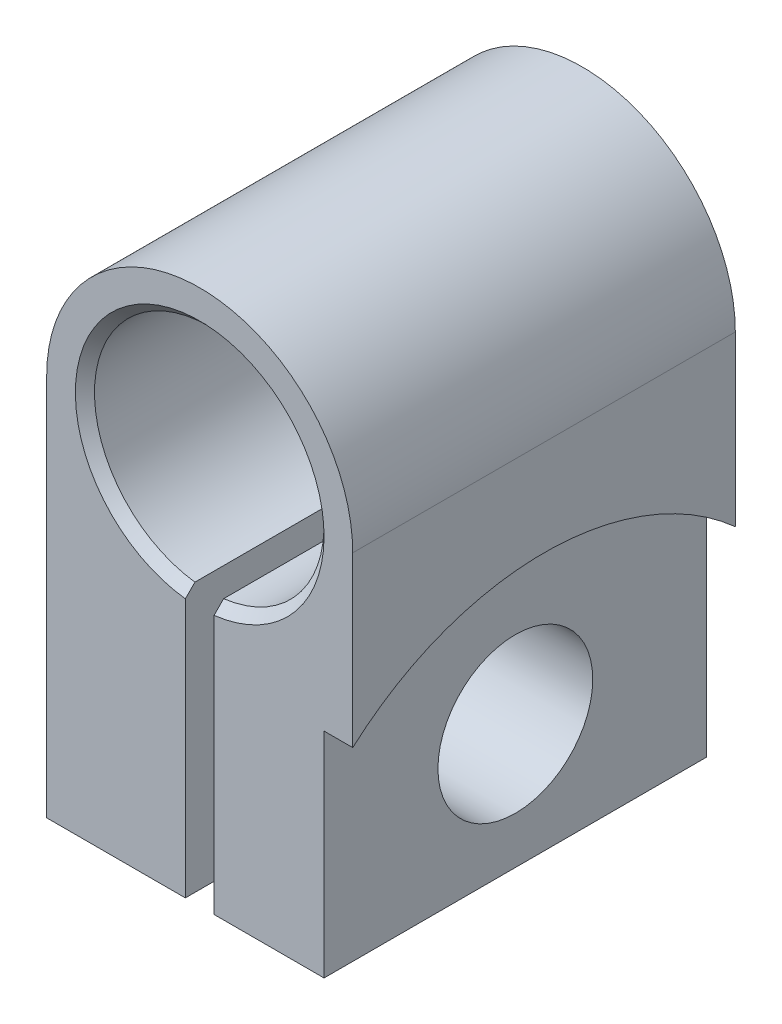
ISO-10303-21;
HEADER;
FILE_DESCRIPTION(('STEP AP214'),'2;1');
FILE_NAME('part.step','',(''),(''),'','','');
FILE_SCHEMA(('AUTOMOTIVE_DESIGN { 1 0 10303 214 1 1 1 1 }'));
ENDSEC;
DATA;
#1=APPLICATION_CONTEXT('core data for automotive mechanical design processes');
#2=APPLICATION_PROTOCOL_DEFINITION('international standard','automotive_design',2000,#1);
#3=PRODUCT_CONTEXT('',#1,'mechanical');
#4=PRODUCT('Part','Part','',(#3));
#5=PRODUCT_RELATED_PRODUCT_CATEGORY('part','',(#4));
#6=PRODUCT_DEFINITION_FORMATION('','',#4);
#7=PRODUCT_DEFINITION_CONTEXT('part definition',#1,'design');
#8=PRODUCT_DEFINITION('design','',#6,#7);
#9=PRODUCT_DEFINITION_SHAPE('','',#8);
#10=(LENGTH_UNIT() NAMED_UNIT(*) SI_UNIT(.MILLI.,.METRE.));
#11=(NAMED_UNIT(*) PLANE_ANGLE_UNIT() SI_UNIT($,.RADIAN.));
#12=(NAMED_UNIT(*) SI_UNIT($,.STERADIAN.) SOLID_ANGLE_UNIT());
#13=UNCERTAINTY_MEASURE_WITH_UNIT(LENGTH_MEASURE(1.E-05),#10,'distance_accuracy_value','');
#14=(GEOMETRIC_REPRESENTATION_CONTEXT(3) GLOBAL_UNCERTAINTY_ASSIGNED_CONTEXT((#13)) GLOBAL_UNIT_ASSIGNED_CONTEXT((#10,
#11,#12)) REPRESENTATION_CONTEXT('',''));
#15=CARTESIAN_POINT('',(0.,0.,0.));
#16=DIRECTION('',(0.,0.,1.));
#17=DIRECTION('',(1.,0.,0.));
#18=AXIS2_PLACEMENT_3D('',#15,#16,#17);
#19=CARTESIAN_POINT('',(8.,-13.983665424699,-20.));
#20=DIRECTION('',(0.,-1.,0.));
#21=DIRECTION('',(0.,0.,-1.));
#22=AXIS2_PLACEMENT_3D('',#19,#20,#21);
#23=PLANE('',#22);
#24=DIRECTION('',(1.,0.,0.));
#25=VECTOR('',#24,1.);
#26=CARTESIAN_POINT('',(8.,-13.983665424699,-20.));
#27=LINE('',#26,#25);
#28=CARTESIAN_POINT('',(0.75,-13.983665424699,-20.));
#29=VERTEX_POINT('',#28);
#30=CARTESIAN_POINT('',(6.5,-13.983665424699,-20.));
#31=VERTEX_POINT('',#30);
#32=EDGE_CURVE('E169',#29,#31,#27,.T.);
#33=ORIENTED_EDGE('',*,*,#32,.T.);
#34=DIRECTION('',(0.,0.,1.));
#35=VECTOR('',#34,1.);
#36=CARTESIAN_POINT('',(6.5,-13.983665424699,-20.));
#37=LINE('',#36,#35);
#38=CARTESIAN_POINT('',(6.5,-13.983665424699,0.));
#39=VERTEX_POINT('',#38);
#40=EDGE_CURVE('E266',#31,#39,#37,.T.);
#41=ORIENTED_EDGE('',*,*,#40,.T.);
#42=DIRECTION('',(1.,0.,0.));
#43=VECTOR('',#42,1.);
#44=CARTESIAN_POINT('',(8.,-13.983665424699,0.));
#45=LINE('',#44,#43);
#46=CARTESIAN_POINT('',(0.75,-13.983665424699,0.));
#47=VERTEX_POINT('',#46);
#48=EDGE_CURVE('E180',#47,#39,#45,.T.);
#49=ORIENTED_EDGE('',*,*,#48,.F.);
#50=DIRECTION('',(0.,0.,1.));
#51=VECTOR('',#50,1.);
#52=CARTESIAN_POINT('',(0.75,-13.983665424699,-20.));
#53=LINE('',#52,#51);
#54=EDGE_CURVE('E177',#29,#47,#53,.T.);
#55=ORIENTED_EDGE('',*,*,#54,.F.);
#56=EDGE_LOOP('',(#33,#41,#49,#55));
#57=FACE_BOUND('',#56,.T.);
#58=ADVANCED_FACE('F41',(#57),#23,.T.);
#59=CARTESIAN_POINT('',(0.,6.01633457530104,-20.));
#60=DIRECTION('',(0.,0.,1.));
#61=DIRECTION('',(1.,0.,0.));
#62=AXIS2_PLACEMENT_3D('',#59,#60,#61);
#63=CYLINDRICAL_SURFACE('',#62,8.);
#64=CARTESIAN_POINT('',(0.,6.01633457530104,0.));
#65=DIRECTION('',(0.,0.,1.));
#66=DIRECTION('',(-1.,0.,0.));
#67=AXIS2_PLACEMENT_3D('',#64,#65,#66);
#68=CIRCLE('',#67,8.);
#69=CARTESIAN_POINT('',(8.,6.01633457530104,0.));
#70=VERTEX_POINT('',#69);
#71=CARTESIAN_POINT('',(-8.,6.01633457530104,0.));
#72=VERTEX_POINT('',#71);
#73=EDGE_CURVE('E173',#70,#72,#68,.T.);
#74=ORIENTED_EDGE('',*,*,#73,.F.);
#75=DIRECTION('',(0.,0.,1.));
#76=VECTOR('',#75,1.);
#77=CARTESIAN_POINT('',(8.,6.01633457530104,-20.));
#78=LINE('',#77,#76);
#79=CARTESIAN_POINT('',(8.,6.01633457530104,-20.));
#80=VERTEX_POINT('',#79);
#81=EDGE_CURVE('E185',#80,#70,#78,.T.);
#82=ORIENTED_EDGE('',*,*,#81,.F.);
#83=CARTESIAN_POINT('',(0.,6.01633457530104,-20.));
#84=DIRECTION('',(0.,0.,1.));
#85=DIRECTION('',(-1.,0.,0.));
#86=AXIS2_PLACEMENT_3D('',#83,#84,#85);
#87=CIRCLE('',#86,8.);
#88=CARTESIAN_POINT('',(-8.,6.01633457530104,-20.));
#89=VERTEX_POINT('',#88);
#90=EDGE_CURVE('E162',#80,#89,#87,.T.);
#91=ORIENTED_EDGE('',*,*,#90,.T.);
#92=DIRECTION('',(0.,0.,1.));
#93=VECTOR('',#92,1.);
#94=CARTESIAN_POINT('',(-8.,6.01633457530104,-20.));
#95=LINE('',#94,#93);
#96=EDGE_CURVE('E163',#89,#72,#95,.T.);
#97=ORIENTED_EDGE('',*,*,#96,.T.);
#98=EDGE_LOOP('',(#74,#82,#91,#97));
#99=FACE_BOUND('',#98,.T.);
#100=ADVANCED_FACE('F290',(#99),#63,.T.);
#101=CARTESIAN_POINT('',(8.,-13.983665424699,-20.));
#102=DIRECTION('',(1.,0.,0.));
#103=DIRECTION('',(0.,0.,-1.));
#104=AXIS2_PLACEMENT_3D('',#101,#102,#103);
#105=PLANE('',#104);
#106=CARTESIAN_POINT('',(8.,-13.983665424699,-10.));
#107=DIRECTION('',(1.,0.,0.));
#108=DIRECTION('',(0.,0.,-1.));
#109=AXIS2_PLACEMENT_3D('',#106,#107,#108);
#110=CIRCLE('',#109,15.);
#111=CARTESIAN_POINT('',(8.,-2.80332553720001,-20.));
#112=VERTEX_POINT('',#111);
#113=CARTESIAN_POINT('',(8.,-2.80332553720001,0.));
#114=VERTEX_POINT('',#113);
#115=EDGE_CURVE('E139',#112,#114,#110,.T.);
#116=ORIENTED_EDGE('',*,*,#115,.F.);
#117=DIRECTION('',(0.,1.,0.));
#118=VECTOR('',#117,1.);
#119=CARTESIAN_POINT('',(8.,-13.983665424699,-20.));
#120=LINE('',#119,#118);
#121=EDGE_CURVE('E152',#112,#80,#120,.T.);
#122=ORIENTED_EDGE('',*,*,#121,.T.);
#123=ORIENTED_EDGE('',*,*,#81,.T.);
#124=DIRECTION('',(0.,1.,0.));
#125=VECTOR('',#124,1.);
#126=CARTESIAN_POINT('',(8.,-13.983665424699,0.));
#127=LINE('',#126,#125);
#128=EDGE_CURVE('E154',#114,#70,#127,.T.);
#129=ORIENTED_EDGE('',*,*,#128,.F.);
#130=EDGE_LOOP('',(#116,#122,#123,#129));
#131=FACE_BOUND('',#130,.T.);
#132=ADVANCED_FACE('F150',(#131),#105,.T.);
#133=DIRECTION('',(0.,0.,1.));
#134=VECTOR('',#133,1.);
#135=CARTESIAN_POINT('',(-0.75,-13.983665424699,-20.));
#136=LINE('',#135,#134);
#137=CARTESIAN_POINT('',(-0.75,-13.983665424699,-20.));
#138=VERTEX_POINT('',#137);
#139=CARTESIAN_POINT('',(-0.75,-13.983665424699,0.));
#140=VERTEX_POINT('',#139);
#141=EDGE_CURVE('E253',#138,#140,#136,.T.);
#142=ORIENTED_EDGE('',*,*,#141,.T.);
#143=CARTESIAN_POINT('',(-8.,-13.983665424699,0.));
#144=VERTEX_POINT('',#143);
#145=EDGE_CURVE('E181',#144,#140,#45,.T.);
#146=ORIENTED_EDGE('',*,*,#145,.F.);
#147=DIRECTION('',(0.,0.,1.));
#148=VECTOR('',#147,1.);
#149=CARTESIAN_POINT('',(-8.,-13.983665424699,-20.));
#150=LINE('',#149,#148);
#151=CARTESIAN_POINT('',(-8.,-13.983665424699,-20.));
#152=VERTEX_POINT('',#151);
#153=EDGE_CURVE('E166',#152,#144,#150,.T.);
#154=ORIENTED_EDGE('',*,*,#153,.F.);
#155=EDGE_CURVE('E164',#152,#138,#27,.T.);
#156=ORIENTED_EDGE('',*,*,#155,.T.);
#157=EDGE_LOOP('',(#142,#146,#154,#156));
#158=FACE_BOUND('',#157,.T.);
#159=ADVANCED_FACE('F278',(#158),#23,.T.);
#160=CARTESIAN_POINT('',(-8.,-13.983665424699,-20.));
#161=DIRECTION('',(-1.,0.,0.));
#162=DIRECTION('',(0.,0.,1.));
#163=AXIS2_PLACEMENT_3D('',#160,#161,#162);
#164=PLANE('',#163);
#165=DIRECTION('',(0.,-1.,0.));
#166=VECTOR('',#165,1.);
#167=CARTESIAN_POINT('',(-8.,-13.983665424699,0.));
#168=LINE('',#167,#166);
#169=EDGE_CURVE('E176',#72,#144,#168,.T.);
#170=ORIENTED_EDGE('',*,*,#169,.F.);
#171=ORIENTED_EDGE('',*,*,#96,.F.);
#172=DIRECTION('',(0.,-1.,0.));
#173=VECTOR('',#172,1.);
#174=CARTESIAN_POINT('',(-8.,-13.983665424699,-20.));
#175=LINE('',#174,#173);
#176=EDGE_CURVE('E259',#89,#152,#175,.T.);
#177=ORIENTED_EDGE('',*,*,#176,.T.);
#178=ORIENTED_EDGE('',*,*,#153,.T.);
#179=EDGE_LOOP('',(#170,#171,#177,#178));
#180=FACE_BOUND('',#179,.T.);
#181=ADVANCED_FACE('F282',(#180),#164,.T.);
#182=CARTESIAN_POINT('',(0.,6.01633457530104,-20.));
#183=DIRECTION('',(0.,0.,-1.));
#184=DIRECTION('',(-1.,0.,0.));
#185=AXIS2_PLACEMENT_3D('',#182,#183,#184);
#186=PLANE('',#185);
#187=DIRECTION('',(0.,1.,0.));
#188=VECTOR('',#187,1.);
#189=CARTESIAN_POINT('',(0.75,-13.983665424699,-20.));
#190=LINE('',#189,#188);
#191=CARTESIAN_POINT('',(0.75,-0.440251209771444,-20.));
#192=VERTEX_POINT('',#191);
#193=EDGE_CURVE('E255',#29,#192,#190,.T.);
#194=ORIENTED_EDGE('',*,*,#193,.T.);
#195=CARTESIAN_POINT('',(0.,6.01633457530104,-20.));
#196=DIRECTION('',(0.,0.,-1.));
#197=DIRECTION('',(-1.,0.,0.));
#198=AXIS2_PLACEMENT_3D('',#195,#196,#197);
#199=CIRCLE('',#198,6.5);
#200=CARTESIAN_POINT('',(-0.75,-0.440251209771444,-20.));
#201=VERTEX_POINT('',#200);
#202=EDGE_CURVE('E223',#192,#201,#199,.F.);
#203=ORIENTED_EDGE('',*,*,#202,.T.);
#204=DIRECTION('',(0.,-1.,0.));
#205=VECTOR('',#204,1.);
#206=CARTESIAN_POINT('',(-0.75,-13.983665424699,-20.));
#207=LINE('',#206,#205);
#208=EDGE_CURVE('E251',#201,#138,#207,.T.);
#209=ORIENTED_EDGE('',*,*,#208,.T.);
#210=ORIENTED_EDGE('',*,*,#155,.F.);
#211=ORIENTED_EDGE('',*,*,#176,.F.);
#212=ORIENTED_EDGE('',*,*,#90,.F.);
#213=ORIENTED_EDGE('',*,*,#121,.F.);
#214=DIRECTION('',(1.,0.,0.));
#215=VECTOR('',#214,1.);
#216=CARTESIAN_POINT('',(6.5,-2.80332553720001,-20.));
#217=LINE('',#216,#215);
#218=CARTESIAN_POINT('',(6.5,-2.80332553720001,-20.));
#219=VERTEX_POINT('',#218);
#220=EDGE_CURVE('E135',#219,#112,#217,.T.);
#221=ORIENTED_EDGE('',*,*,#220,.F.);
#222=DIRECTION('',(0.,-1.,0.));
#223=VECTOR('',#222,1.);
#224=CARTESIAN_POINT('',(6.5,6.01633457530104,-20.));
#225=LINE('',#224,#223);
#226=EDGE_CURVE('E146',#219,#31,#225,.T.);
#227=ORIENTED_EDGE('',*,*,#226,.T.);
#228=ORIENTED_EDGE('',*,*,#32,.F.);
#229=EDGE_LOOP('',(#194,#203,#209,#210,#211,#212,#213,#221,#227,#228));
#230=FACE_BOUND('',#229,.T.);
#231=ADVANCED_FACE('F159',(#230),#186,.T.);
#232=CARTESIAN_POINT('',(0.,6.01633457530104,0.));
#233=DIRECTION('',(0.,0.,-1.));
#234=DIRECTION('',(-1.,0.,0.));
#235=AXIS2_PLACEMENT_3D('',#232,#233,#234);
#236=PLANE('',#235);
#237=DIRECTION('',(0.,-1.,0.));
#238=VECTOR('',#237,1.);
#239=CARTESIAN_POINT('',(-0.75,-13.983665424699,0.));
#240=LINE('',#239,#238);
#241=CARTESIAN_POINT('',(-0.75,-0.440251209771451,0.));
#242=VERTEX_POINT('',#241);
#243=EDGE_CURVE('E242',#242,#140,#240,.T.);
#244=ORIENTED_EDGE('',*,*,#243,.F.);
#245=CARTESIAN_POINT('',(0.,6.01633457530104,0.));
#246=DIRECTION('',(0.,0.,-1.));
#247=DIRECTION('',(-1.,0.,0.));
#248=AXIS2_PLACEMENT_3D('',#245,#246,#247);
#249=CIRCLE('',#248,6.50000000000001);
#250=CARTESIAN_POINT('',(0.75,-0.440251209771451,0.));
#251=VERTEX_POINT('',#250);
#252=EDGE_CURVE('E202',#242,#251,#249,.T.);
#253=ORIENTED_EDGE('',*,*,#252,.T.);
#254=DIRECTION('',(0.,1.,0.));
#255=VECTOR('',#254,1.);
#256=CARTESIAN_POINT('',(0.75,-13.983665424699,0.));
#257=LINE('',#256,#255);
#258=EDGE_CURVE('E145',#47,#251,#257,.T.);
#259=ORIENTED_EDGE('',*,*,#258,.F.);
#260=ORIENTED_EDGE('',*,*,#48,.T.);
#261=DIRECTION('',(0.,-1.,0.));
#262=VECTOR('',#261,1.);
#263=CARTESIAN_POINT('',(6.5,6.01633457530104,0.));
#264=LINE('',#263,#262);
#265=CARTESIAN_POINT('',(6.5,-2.80332553720001,0.));
#266=VERTEX_POINT('',#265);
#267=EDGE_CURVE('E187',#266,#39,#264,.T.);
#268=ORIENTED_EDGE('',*,*,#267,.F.);
#269=DIRECTION('',(1.,0.,0.));
#270=VECTOR('',#269,1.);
#271=CARTESIAN_POINT('',(6.5,-2.80332553720001,0.));
#272=LINE('',#271,#270);
#273=EDGE_CURVE('E190',#266,#114,#272,.T.);
#274=ORIENTED_EDGE('',*,*,#273,.T.);
#275=ORIENTED_EDGE('',*,*,#128,.T.);
#276=ORIENTED_EDGE('',*,*,#73,.T.);
#277=ORIENTED_EDGE('',*,*,#169,.T.);
#278=ORIENTED_EDGE('',*,*,#145,.T.);
#279=EDGE_LOOP('',(#244,#253,#259,#260,#268,#274,#275,#276,#277,#278));
#280=FACE_BOUND('',#279,.T.);
#281=ADVANCED_FACE('F239',(#280),#236,.F.);
#282=CARTESIAN_POINT('',(0.,6.01633457530104,-20.));
#283=DIRECTION('',(0.,0.,1.));
#284=DIRECTION('',(1.,0.,0.));
#285=AXIS2_PLACEMENT_3D('',#282,#283,#284);
#286=CYLINDRICAL_SURFACE('',#285,6.);
#287=DIRECTION('',(0.,0.,1.));
#288=VECTOR('',#287,1.);
#289=CARTESIAN_POINT('',(-0.75,0.0633941254057115,-20.));
#290=LINE('',#289,#288);
#291=CARTESIAN_POINT('',(-0.75,0.0633941254057115,-19.5));
#292=VERTEX_POINT('',#291);
#293=CARTESIAN_POINT('',(-0.75,0.0633941254057115,-0.500000000000004));
#294=VERTEX_POINT('',#293);
#295=EDGE_CURVE('E248',#292,#294,#290,.T.);
#296=ORIENTED_EDGE('',*,*,#295,.F.);
#297=CARTESIAN_POINT('',(0.,6.01633457530104,-19.5));
#298=DIRECTION('',(0.,0.,-1.));
#299=DIRECTION('',(-1.,0.,0.));
#300=AXIS2_PLACEMENT_3D('',#297,#298,#299);
#301=CIRCLE('',#300,6.);
#302=CARTESIAN_POINT('',(0.75,0.0633941254057115,-19.5));
#303=VERTEX_POINT('',#302);
#304=EDGE_CURVE('E56',#292,#303,#301,.T.);
#305=ORIENTED_EDGE('',*,*,#304,.T.);
#306=DIRECTION('',(0.,0.,1.));
#307=VECTOR('',#306,1.);
#308=CARTESIAN_POINT('',(0.75,0.0633941254057115,-20.));
#309=LINE('',#308,#307);
#310=CARTESIAN_POINT('',(0.75,0.0633941254057115,-0.500000000000004));
#311=VERTEX_POINT('',#310);
#312=EDGE_CURVE('E249',#303,#311,#309,.T.);
#313=ORIENTED_EDGE('',*,*,#312,.T.);
#314=CARTESIAN_POINT('',(0.,6.01633457530104,-0.500000000000004));
#315=DIRECTION('',(0.,0.,-1.));
#316=DIRECTION('',(-1.,0.,0.));
#317=AXIS2_PLACEMENT_3D('',#314,#315,#316);
#318=CIRCLE('',#317,6.);
#319=EDGE_CURVE('E192',#311,#294,#318,.F.);
#320=ORIENTED_EDGE('',*,*,#319,.T.);
#321=EDGE_LOOP('',(#296,#305,#313,#320));
#322=FACE_BOUND('',#321,.T.);
#323=ADVANCED_FACE('F247',(#322),#286,.F.);
#324=CARTESIAN_POINT('',(0.75,-13.983665424699,-20.));
#325=DIRECTION('',(1.,0.,0.));
#326=DIRECTION('',(0.,0.,-1.));
#327=AXIS2_PLACEMENT_3D('',#324,#325,#326);
#328=PLANE('',#327);
#329=CARTESIAN_POINT('',(0.750000000000001,-7.48366542469896,-10.));
#330=DIRECTION('',(1.,0.,0.));
#331=DIRECTION('',(0.,0.,-1.));
#332=AXIS2_PLACEMENT_3D('',#329,#330,#331);
#333=CIRCLE('',#332,4.04660050703483);
#334=CARTESIAN_POINT('',(0.750000000000001,-7.48366542469896,-14.0466005070348));
#335=VERTEX_POINT('',#334);
#336=EDGE_CURVE('E155',#335,#335,#333,.F.);
#337=ORIENTED_EDGE('',*,*,#336,.F.);
#338=EDGE_LOOP('',(#337));
#339=FACE_BOUND('',#338,.T.);
#340=ORIENTED_EDGE('',*,*,#312,.F.);
#341=CARTESIAN_POINT('',(0.75,0.0633941254057115,-19.5));
#342=CARTESIAN_POINT('',(0.75,-0.0205711540442242,-19.5833087654021));
#343=CARTESIAN_POINT('',(0.75,-0.104524238403231,-19.6666298148055));
#344=CARTESIAN_POINT('',(0.75,-0.272406016795573,-19.8332964814722));
#345=CARTESIAN_POINT('',(0.75,-0.356334710828951,-19.9166420987355));
#346=CARTESIAN_POINT('',(0.75,-0.440251209771441,-20.));
#347=B_SPLINE_CURVE_WITH_KNOTS('',3,(#341,#342,#343,#344,#345,#346),.UNSPECIFIED.,.F.,.F.,(4,2,
4),(0.,0.354844555860319,0.709689111112692),.UNSPECIFIED.);
#348=EDGE_CURVE('E11',#303,#192,#347,.T.);
#349=ORIENTED_EDGE('',*,*,#348,.T.);
#350=ORIENTED_EDGE('',*,*,#193,.F.);
#351=ORIENTED_EDGE('',*,*,#54,.T.);
#352=ORIENTED_EDGE('',*,*,#258,.T.);
#353=CARTESIAN_POINT('',(0.75,-0.440251209771448,0.));
#354=CARTESIAN_POINT('',(0.75,-0.356334710828956,-0.0833579012645175));
#355=CARTESIAN_POINT('',(0.75,-0.272406016795578,-0.16670351852776));
#356=CARTESIAN_POINT('',(0.75,-0.104524238403233,-0.333370185194471));
#357=CARTESIAN_POINT('',(0.75,-0.0205711540442254,-0.416691234597896));
#358=CARTESIAN_POINT('',(0.75,0.0633941254057111,-0.500000000000004));
#359=B_SPLINE_CURVE_WITH_KNOTS('',3,(#353,#354,#355,#356,#357,#358),.UNSPECIFIED.,.F.,.F.,(4,2,
4),(0.,0.354844555252374,0.709689111112695),.UNSPECIFIED.);
#360=EDGE_CURVE('E225',#251,#311,#359,.T.);
#361=ORIENTED_EDGE('',*,*,#360,.T.);
#362=EDGE_LOOP('',(#340,#349,#350,#351,#352,#361));
#363=FACE_BOUND('',#362,.T.);
#364=ADVANCED_FACE('F212',(#339,#363),#328,.F.);
#365=CARTESIAN_POINT('',(-0.75,-13.983665424699,-20.));
#366=DIRECTION('',(-1.,0.,0.));
#367=DIRECTION('',(0.,0.,1.));
#368=AXIS2_PLACEMENT_3D('',#365,#366,#367);
#369=PLANE('',#368);
#370=ORIENTED_EDGE('',*,*,#208,.F.);
#371=CARTESIAN_POINT('',(-0.75,-0.440251209771441,-20.));
#372=CARTESIAN_POINT('',(-0.75,-0.35633471082895,-19.9166420987355));
#373=CARTESIAN_POINT('',(-0.75,-0.272406016795573,-19.8332964814722));
#374=CARTESIAN_POINT('',(-0.75,-0.104524238403231,-19.6666298148055));
#375=CARTESIAN_POINT('',(-0.75,-0.0205711540442247,-19.5833087654021));
#376=CARTESIAN_POINT('',(-0.75,0.0633941254057106,-19.5));
#377=B_SPLINE_CURVE_WITH_KNOTS('',3,(#371,#372,#373,#374,#375,#376),.UNSPECIFIED.,.F.,.F.,(4,2,
4),(0.,0.354844555252373,0.709689111112691),.UNSPECIFIED.);
#378=EDGE_CURVE('E70',#201,#292,#377,.T.);
#379=ORIENTED_EDGE('',*,*,#378,.T.);
#380=ORIENTED_EDGE('',*,*,#295,.T.);
#381=CARTESIAN_POINT('',(-0.75,0.0633941254057115,-0.500000000000004));
#382=CARTESIAN_POINT('',(-0.75,-0.0205711540442252,-0.416691234597896));
#383=CARTESIAN_POINT('',(-0.75,-0.104524238403233,-0.333370185194471));
#384=CARTESIAN_POINT('',(-0.75,-0.272406016795578,-0.16670351852776));
#385=CARTESIAN_POINT('',(-0.75,-0.356334710828956,-0.0833579012645175));
#386=CARTESIAN_POINT('',(-0.75,-0.440251209771448,0.));
#387=B_SPLINE_CURVE_WITH_KNOTS('',3,(#381,#382,#383,#384,#385,#386),.UNSPECIFIED.,.F.,.F.,(4,2,
4),(0.,0.354844555860321,0.709689111112695),.UNSPECIFIED.);
#388=EDGE_CURVE('E195',#294,#242,#387,.T.);
#389=ORIENTED_EDGE('',*,*,#388,.T.);
#390=ORIENTED_EDGE('',*,*,#243,.T.);
#391=ORIENTED_EDGE('',*,*,#141,.F.);
#392=EDGE_LOOP('',(#370,#379,#380,#389,#390,#391));
#393=FACE_BOUND('',#392,.T.);
#394=ADVANCED_FACE('F208',(#393),#369,.F.);
#395=CARTESIAN_POINT('',(6.5,-13.983665424699,-10.));
#396=DIRECTION('',(1.,0.,0.));
#397=DIRECTION('',(0.,0.,-1.));
#398=AXIS2_PLACEMENT_3D('',#395,#396,#397);
#399=CYLINDRICAL_SURFACE('',#398,15.);
#400=ORIENTED_EDGE('',*,*,#220,.T.);
#401=ORIENTED_EDGE('',*,*,#115,.T.);
#402=ORIENTED_EDGE('',*,*,#273,.F.);
#403=CARTESIAN_POINT('',(6.5,-13.983665424699,-10.));
#404=DIRECTION('',(1.,0.,0.));
#405=DIRECTION('',(0.,0.,-1.));
#406=AXIS2_PLACEMENT_3D('',#403,#404,#405);
#407=CIRCLE('',#406,15.);
#408=EDGE_CURVE('E141',#219,#266,#407,.T.);
#409=ORIENTED_EDGE('',*,*,#408,.F.);
#410=EDGE_LOOP('',(#400,#401,#402,#409));
#411=FACE_BOUND('',#410,.T.);
#412=ADVANCED_FACE('F137',(#411),#399,.F.);
#413=CARTESIAN_POINT('',(6.5,-13.983665424699,-10.));
#414=DIRECTION('',(1.,0.,0.));
#415=DIRECTION('',(0.,0.,-1.));
#416=AXIS2_PLACEMENT_3D('',#413,#414,#415);
#417=PLANE('',#416);
#418=CARTESIAN_POINT('',(6.5,-7.48366542469896,-10.));
#419=DIRECTION('',(1.,0.,0.));
#420=DIRECTION('',(0.,0.,-1.));
#421=AXIS2_PLACEMENT_3D('',#418,#419,#420);
#422=CIRCLE('',#421,4.04660050703483);
#423=CARTESIAN_POINT('',(6.5,-7.48366542469896,-14.0466005070348));
#424=VERTEX_POINT('',#423);
#425=EDGE_CURVE('E319',#424,#424,#422,.T.);
#426=ORIENTED_EDGE('',*,*,#425,.F.);
#427=EDGE_LOOP('',(#426));
#428=FACE_BOUND('',#427,.T.);
#429=ORIENTED_EDGE('',*,*,#408,.T.);
#430=ORIENTED_EDGE('',*,*,#267,.T.);
#431=ORIENTED_EDGE('',*,*,#40,.F.);
#432=ORIENTED_EDGE('',*,*,#226,.F.);
#433=EDGE_LOOP('',(#429,#430,#431,#432));
#434=FACE_BOUND('',#433,.T.);
#435=ADVANCED_FACE('F324',(#428,#434),#417,.T.);
#436=CARTESIAN_POINT('',(-8.001,-7.48366542469896,-10.));
#437=DIRECTION('',(1.,0.,0.));
#438=DIRECTION('',(0.,0.,-1.));
#439=AXIS2_PLACEMENT_3D('',#436,#437,#438);
#440=CYLINDRICAL_SURFACE('',#439,4.04660050703483);
#441=ORIENTED_EDGE('',*,*,#425,.T.);
#442=EDGE_LOOP('',(#441));
#443=FACE_BOUND('',#442,.T.);
#444=ORIENTED_EDGE('',*,*,#336,.T.);
#445=EDGE_LOOP('',(#444));
#446=FACE_BOUND('',#445,.T.);
#447=ADVANCED_FACE('F288',(#443,#446),#440,.F.);
#448=CARTESIAN_POINT('',(0.,6.01633457530104,-0.500000000000004));
#449=DIRECTION('',(0.,0.,1.));
#450=DIRECTION('',(1.,0.,0.));
#451=AXIS2_PLACEMENT_3D('',#448,#449,#450);
#452=CONICAL_SURFACE('',#451,6.,0.785398163397453);
#453=ORIENTED_EDGE('',*,*,#360,.F.);
#454=ORIENTED_EDGE('',*,*,#252,.F.);
#455=ORIENTED_EDGE('',*,*,#388,.F.);
#456=ORIENTED_EDGE('',*,*,#319,.F.);
#457=EDGE_LOOP('',(#453,#454,#455,#456));
#458=FACE_BOUND('',#457,.T.);
#459=ADVANCED_FACE('F205',(#458),#452,.F.);
#460=CARTESIAN_POINT('',(0.,6.01633457530104,-20.));
#461=DIRECTION('',(0.,0.,-1.));
#462=DIRECTION('',(-1.,0.,0.));
#463=AXIS2_PLACEMENT_3D('',#460,#461,#462);
#464=CONICAL_SURFACE('',#463,6.5,0.785398163397442);
#465=ORIENTED_EDGE('',*,*,#348,.F.);
#466=ORIENTED_EDGE('',*,*,#304,.F.);
#467=ORIENTED_EDGE('',*,*,#378,.F.);
#468=ORIENTED_EDGE('',*,*,#202,.F.);
#469=EDGE_LOOP('',(#465,#466,#467,#468));
#470=FACE_BOUND('',#469,.T.);
#471=ADVANCED_FACE('F44',(#470),#464,.F.);
#472=CLOSED_SHELL('',(#58,#100,#132,#159,#181,#231,#281,#323,#364,#394,#412,#435,#447,#459,#471));
#473=MANIFOLD_SOLID_BREP('B2',#472);
#474=ADVANCED_BREP_SHAPE_REPRESENTATION('',(#18,#473),#14);
#475=SHAPE_DEFINITION_REPRESENTATION(#9,#474);
ENDSEC;
END-ISO-10303-21;
